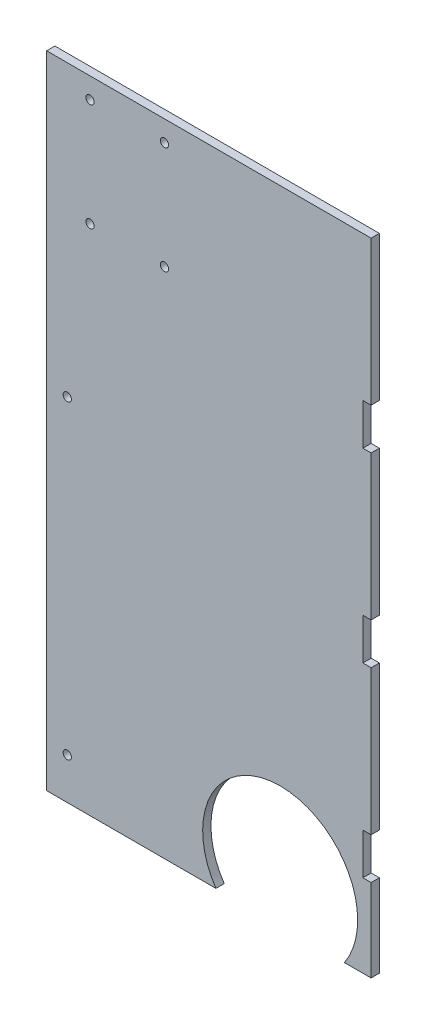
ISO-10303-21;
HEADER;
FILE_DESCRIPTION(('STEP AP214'),'2;1');
FILE_NAME('part.step','',(''),(''),'','','');
FILE_SCHEMA(('AUTOMOTIVE_DESIGN { 1 0 10303 214 1 1 1 1 }'));
ENDSEC;
DATA;
#1=APPLICATION_CONTEXT('core data for automotive mechanical design processes');
#2=APPLICATION_PROTOCOL_DEFINITION('international standard','automotive_design',2000,#1);
#3=PRODUCT_CONTEXT('',#1,'mechanical');
#4=PRODUCT('Part','Part','',(#3));
#5=PRODUCT_RELATED_PRODUCT_CATEGORY('part','',(#4));
#6=PRODUCT_DEFINITION_FORMATION('','',#4);
#7=PRODUCT_DEFINITION_CONTEXT('part definition',#1,'design');
#8=PRODUCT_DEFINITION('design','',#6,#7);
#9=PRODUCT_DEFINITION_SHAPE('','',#8);
#10=(LENGTH_UNIT() NAMED_UNIT(*) SI_UNIT(.MILLI.,.METRE.));
#11=(NAMED_UNIT(*) PLANE_ANGLE_UNIT() SI_UNIT($,.RADIAN.));
#12=(NAMED_UNIT(*) SI_UNIT($,.STERADIAN.) SOLID_ANGLE_UNIT());
#13=UNCERTAINTY_MEASURE_WITH_UNIT(LENGTH_MEASURE(1.E-05),#10,'distance_accuracy_value','');
#14=(GEOMETRIC_REPRESENTATION_CONTEXT(3) GLOBAL_UNCERTAINTY_ASSIGNED_CONTEXT((#13)) GLOBAL_UNIT_ASSIGNED_CONTEXT((#10,
#11,#12)) REPRESENTATION_CONTEXT('',''));
#15=CARTESIAN_POINT('',(0.,0.,0.));
#16=DIRECTION('',(0.,0.,1.));
#17=DIRECTION('',(1.,0.,0.));
#18=AXIS2_PLACEMENT_3D('',#15,#16,#17);
#19=CARTESIAN_POINT('',(82.0000000000016,149.999999999996,4.));
#20=DIRECTION('',(-1.,0.,0.));
#21=DIRECTION('',(0.,-1.,0.));
#22=AXIS2_PLACEMENT_3D('',#19,#20,#21);
#23=PLANE('',#22);
#24=DIRECTION('',(0.,1.,0.));
#25=VECTOR('',#24,1.);
#26=CARTESIAN_POINT('',(82.0000000000016,149.999999999996,0.));
#27=LINE('',#26,#25);
#28=CARTESIAN_POINT('',(82.0000000000016,-30.0000000000036,0.));
#29=VERTEX_POINT('',#28);
#30=CARTESIAN_POINT('',(82.0000000000015,39.9999999999964,0.));
#31=VERTEX_POINT('',#30);
#32=EDGE_CURVE('E415',#29,#31,#27,.T.);
#33=ORIENTED_EDGE('',*,*,#32,.T.);
#34=DIRECTION('',(0.,0.,-1.));
#35=VECTOR('',#34,1.);
#36=CARTESIAN_POINT('',(82.0000000000015,39.9999999999964,4.));
#37=LINE('',#36,#35);
#38=CARTESIAN_POINT('',(82.0000000000015,39.9999999999964,4.));
#39=VERTEX_POINT('',#38);
#40=EDGE_CURVE('E281',#39,#31,#37,.T.);
#41=ORIENTED_EDGE('',*,*,#40,.F.);
#42=DIRECTION('',(0.,1.,0.));
#43=VECTOR('',#42,1.);
#44=CARTESIAN_POINT('',(82.0000000000016,149.999999999996,4.));
#45=LINE('',#44,#43);
#46=CARTESIAN_POINT('',(82.0000000000016,-30.0000000000036,4.));
#47=VERTEX_POINT('',#46);
#48=EDGE_CURVE('E429',#47,#39,#45,.T.);
#49=ORIENTED_EDGE('',*,*,#48,.F.);
#50=DIRECTION('',(0.,0.,-1.));
#51=VECTOR('',#50,1.);
#52=CARTESIAN_POINT('',(82.0000000000016,-30.0000000000036,4.));
#53=LINE('',#52,#51);
#54=EDGE_CURVE('E252',#47,#29,#53,.T.);
#55=ORIENTED_EDGE('',*,*,#54,.T.);
#56=EDGE_LOOP('',(#33,#41,#49,#55));
#57=FACE_BOUND('',#56,.T.);
#58=ADVANCED_FACE('F33',(#57),#23,.F.);
#59=CARTESIAN_POINT('',(82.0000000000015,-120.000000000004,0.));
#60=VERTEX_POINT('',#59);
#61=CARTESIAN_POINT('',(82.0000000000016,-50.0000000000036,0.));
#62=VERTEX_POINT('',#61);
#63=EDGE_CURVE('E217',#60,#62,#27,.T.);
#64=ORIENTED_EDGE('',*,*,#63,.T.);
#65=DIRECTION('',(0.,0.,-1.));
#66=VECTOR('',#65,1.);
#67=CARTESIAN_POINT('',(82.0000000000016,-50.0000000000036,4.));
#68=LINE('',#67,#66);
#69=CARTESIAN_POINT('',(82.0000000000016,-50.0000000000036,4.));
#70=VERTEX_POINT('',#69);
#71=EDGE_CURVE('E256',#70,#62,#68,.T.);
#72=ORIENTED_EDGE('',*,*,#71,.F.);
#73=CARTESIAN_POINT('',(82.0000000000016,-120.000000000004,4.));
#74=VERTEX_POINT('',#73);
#75=EDGE_CURVE('E221',#74,#70,#45,.T.);
#76=ORIENTED_EDGE('',*,*,#75,.F.);
#77=DIRECTION('',(0.,0.,-1.));
#78=VECTOR('',#77,1.);
#79=CARTESIAN_POINT('',(82.0000000000016,-120.000000000004,4.));
#80=LINE('',#79,#78);
#81=EDGE_CURVE('E224',#74,#60,#80,.T.);
#82=ORIENTED_EDGE('',*,*,#81,.T.);
#83=EDGE_LOOP('',(#64,#72,#76,#82));
#84=FACE_BOUND('',#83,.T.);
#85=ADVANCED_FACE('F374',(#84),#23,.F.);
#86=CARTESIAN_POINT('',(82.0000000000008,-180.000000000003,0.));
#87=VERTEX_POINT('',#86);
#88=CARTESIAN_POINT('',(82.0000000000016,-140.000000000004,0.));
#89=VERTEX_POINT('',#88);
#90=EDGE_CURVE('E214',#87,#89,#27,.T.);
#91=ORIENTED_EDGE('',*,*,#90,.T.);
#92=DIRECTION('',(0.,0.,-1.));
#93=VECTOR('',#92,1.);
#94=CARTESIAN_POINT('',(82.0000000000016,-140.000000000004,4.));
#95=LINE('',#94,#93);
#96=CARTESIAN_POINT('',(82.0000000000016,-140.000000000004,4.));
#97=VERTEX_POINT('',#96);
#98=EDGE_CURVE('E228',#97,#89,#95,.T.);
#99=ORIENTED_EDGE('',*,*,#98,.F.);
#100=CARTESIAN_POINT('',(82.0000000000008,-180.000000000003,4.));
#101=VERTEX_POINT('',#100);
#102=EDGE_CURVE('E211',#101,#97,#45,.T.);
#103=ORIENTED_EDGE('',*,*,#102,.F.);
#104=DIRECTION('',(0.,0.,1.));
#105=VECTOR('',#104,1.);
#106=CARTESIAN_POINT('',(82.0000000000008,-180.000000000003,0.));
#107=LINE('',#106,#105);
#108=EDGE_CURVE('E242',#87,#101,#107,.T.);
#109=ORIENTED_EDGE('',*,*,#108,.F.);
#110=EDGE_LOOP('',(#91,#99,#103,#109));
#111=FACE_BOUND('',#110,.T.);
#112=ADVANCED_FACE('F380',(#111),#23,.F.);
#113=CARTESIAN_POINT('',(-74.9999999999984,-180.000000000003,4.));
#114=DIRECTION('',(0.,1.,0.));
#115=DIRECTION('',(0.,0.,1.));
#116=AXIS2_PLACEMENT_3D('',#113,#114,#115);
#117=PLANE('',#116);
#118=DIRECTION('',(1.,0.,0.));
#119=VECTOR('',#118,1.);
#120=CARTESIAN_POINT('',(-74.9999999999984,-180.000000000003,0.));
#121=LINE('',#120,#119);
#122=CARTESIAN_POINT('',(-74.9999999999984,-180.000000000003,0.));
#123=VERTEX_POINT('',#122);
#124=CARTESIAN_POINT('',(6.93152723420449,-180.000000000003,0.));
#125=VERTEX_POINT('',#124);
#126=EDGE_CURVE('E180',#123,#125,#121,.T.);
#127=ORIENTED_EDGE('',*,*,#126,.T.);
#128=DIRECTION('',(0.,0.,1.));
#129=VECTOR('',#128,1.);
#130=CARTESIAN_POINT('',(6.93152723420449,-180.000000000003,0.));
#131=LINE('',#130,#129);
#132=CARTESIAN_POINT('',(6.93152723420449,-180.000000000003,4.));
#133=VERTEX_POINT('',#132);
#134=EDGE_CURVE('E189',#125,#133,#131,.T.);
#135=ORIENTED_EDGE('',*,*,#134,.T.);
#136=DIRECTION('',(1.,0.,0.));
#137=VECTOR('',#136,1.);
#138=CARTESIAN_POINT('',(-74.9999999999984,-180.000000000003,4.));
#139=LINE('',#138,#137);
#140=CARTESIAN_POINT('',(-74.9999999999984,-180.000000000003,4.));
#141=VERTEX_POINT('',#140);
#142=EDGE_CURVE('E183',#141,#133,#139,.T.);
#143=ORIENTED_EDGE('',*,*,#142,.F.);
#144=DIRECTION('',(0.,0.,-1.));
#145=VECTOR('',#144,1.);
#146=CARTESIAN_POINT('',(-74.9999999999984,-180.000000000003,4.));
#147=LINE('',#146,#145);
#148=EDGE_CURVE('E41',#141,#123,#147,.T.);
#149=ORIENTED_EDGE('',*,*,#148,.T.);
#150=EDGE_LOOP('',(#127,#135,#143,#149));
#151=FACE_BOUND('',#150,.T.);
#152=ADVANCED_FACE('F195',(#151),#117,.F.);
#153=CARTESIAN_POINT('',(-74.9999999999984,149.999999999996,4.));
#154=DIRECTION('',(1.,0.,0.));
#155=DIRECTION('',(0.,1.,0.));
#156=AXIS2_PLACEMENT_3D('',#153,#154,#155);
#157=PLANE('',#156);
#158=DIRECTION('',(0.,-1.,0.));
#159=VECTOR('',#158,1.);
#160=CARTESIAN_POINT('',(-74.9999999999984,149.999999999996,4.));
#161=LINE('',#160,#159);
#162=CARTESIAN_POINT('',(-74.9999999999984,129.999999999996,4.));
#163=VERTEX_POINT('',#162);
#164=EDGE_CURVE('E161',#163,#141,#161,.T.);
#165=ORIENTED_EDGE('',*,*,#164,.F.);
#166=DIRECTION('',(0.,0.,-1.));
#167=VECTOR('',#166,1.);
#168=CARTESIAN_POINT('',(-74.9999999999984,129.999999999996,4.));
#169=LINE('',#168,#167);
#170=CARTESIAN_POINT('',(-74.9999999999984,129.999999999996,0.));
#171=VERTEX_POINT('',#170);
#172=EDGE_CURVE('E170',#163,#171,#169,.T.);
#173=ORIENTED_EDGE('',*,*,#172,.T.);
#174=DIRECTION('',(0.,-1.,0.));
#175=VECTOR('',#174,1.);
#176=CARTESIAN_POINT('',(-74.9999999999984,149.999999999996,0.));
#177=LINE('',#176,#175);
#178=EDGE_CURVE('E192',#171,#123,#177,.T.);
#179=ORIENTED_EDGE('',*,*,#178,.T.);
#180=ORIENTED_EDGE('',*,*,#148,.F.);
#181=EDGE_LOOP('',(#165,#173,#179,#180));
#182=FACE_BOUND('',#181,.T.);
#183=ADVANCED_FACE('F35',(#182),#157,.F.);
#184=CARTESIAN_POINT('',(69.0684727658297,-180.000000000003,0.));
#185=VERTEX_POINT('',#184);
#186=EDGE_CURVE('E186',#185,#87,#121,.T.);
#187=ORIENTED_EDGE('',*,*,#186,.T.);
#188=ORIENTED_EDGE('',*,*,#108,.T.);
#189=CARTESIAN_POINT('',(69.0684727658297,-180.000000000003,4.));
#190=VERTEX_POINT('',#189);
#191=EDGE_CURVE('E179',#190,#101,#139,.T.);
#192=ORIENTED_EDGE('',*,*,#191,.F.);
#193=DIRECTION('',(0.,0.,1.));
#194=VECTOR('',#193,1.);
#195=CARTESIAN_POINT('',(69.0684727658297,-180.000000000003,0.));
#196=LINE('',#195,#194);
#197=EDGE_CURVE('E204',#190,#185,#196,.F.);
#198=ORIENTED_EDGE('',*,*,#197,.T.);
#199=EDGE_LOOP('',(#187,#188,#192,#198));
#200=FACE_BOUND('',#199,.T.);
#201=ADVANCED_FACE('F208',(#200),#117,.F.);
#202=CARTESIAN_POINT('',(0.,0.,4.));
#203=DIRECTION('',(0.,0.,1.));
#204=DIRECTION('',(1.,0.,0.));
#205=AXIS2_PLACEMENT_3D('',#202,#203,#204);
#206=PLANE('',#205);
#207=DIRECTION('',(-1.,0.,0.));
#208=VECTOR('',#207,1.);
#209=CARTESIAN_POINT('',(78.0000000000015,129.999999999996,4.));
#210=LINE('',#209,#208);
#211=CARTESIAN_POINT('',(82.0000000000016,129.999999999996,4.));
#212=VERTEX_POINT('',#211);
#213=EDGE_CURVE('E48',#212,#163,#210,.T.);
#214=ORIENTED_EDGE('',*,*,#213,.T.);
#215=ORIENTED_EDGE('',*,*,#164,.T.);
#216=ORIENTED_EDGE('',*,*,#142,.T.);
#217=CARTESIAN_POINT('',(38.0000000000171,-159.000000000004,4.));
#218=DIRECTION('',(0.,0.,1.));
#219=DIRECTION('',(1.,0.,0.));
#220=AXIS2_PLACEMENT_3D('',#217,#218,#219);
#221=CIRCLE('',#220,37.5);
#222=EDGE_CURVE('E210',#190,#133,#221,.T.);
#223=ORIENTED_EDGE('',*,*,#222,.F.);
#224=ORIENTED_EDGE('',*,*,#191,.T.);
#225=ORIENTED_EDGE('',*,*,#102,.T.);
#226=DIRECTION('',(-1.,0.,0.));
#227=VECTOR('',#226,1.);
#228=CARTESIAN_POINT('',(78.0000000000015,-140.000000000004,4.));
#229=LINE('',#228,#227);
#230=CARTESIAN_POINT('',(78.0000000000015,-140.000000000004,4.));
#231=VERTEX_POINT('',#230);
#232=EDGE_CURVE('E225',#97,#231,#229,.T.);
#233=ORIENTED_EDGE('',*,*,#232,.T.);
#234=DIRECTION('',(0.,1.,0.));
#235=VECTOR('',#234,1.);
#236=CARTESIAN_POINT('',(78.0000000000015,-120.000000000004,4.));
#237=LINE('',#236,#235);
#238=CARTESIAN_POINT('',(78.0000000000015,-120.000000000004,4.));
#239=VERTEX_POINT('',#238);
#240=EDGE_CURVE('E236',#231,#239,#237,.T.);
#241=ORIENTED_EDGE('',*,*,#240,.T.);
#242=DIRECTION('',(1.,0.,0.));
#243=VECTOR('',#242,1.);
#244=CARTESIAN_POINT('',(78.0000000000015,-120.000000000004,4.));
#245=LINE('',#244,#243);
#246=EDGE_CURVE('E245',#239,#74,#245,.T.);
#247=ORIENTED_EDGE('',*,*,#246,.T.);
#248=ORIENTED_EDGE('',*,*,#75,.T.);
#249=DIRECTION('',(-1.,0.,0.));
#250=VECTOR('',#249,1.);
#251=CARTESIAN_POINT('',(78.0000000000015,-50.0000000000036,4.));
#252=LINE('',#251,#250);
#253=CARTESIAN_POINT('',(78.0000000000015,-50.0000000000036,4.));
#254=VERTEX_POINT('',#253);
#255=EDGE_CURVE('E253',#70,#254,#252,.T.);
#256=ORIENTED_EDGE('',*,*,#255,.T.);
#257=DIRECTION('',(0.,1.,0.));
#258=VECTOR('',#257,1.);
#259=CARTESIAN_POINT('',(78.0000000000015,-30.0000000000036,4.));
#260=LINE('',#259,#258);
#261=CARTESIAN_POINT('',(78.0000000000015,-30.0000000000036,4.));
#262=VERTEX_POINT('',#261);
#263=EDGE_CURVE('E264',#254,#262,#260,.T.);
#264=ORIENTED_EDGE('',*,*,#263,.T.);
#265=DIRECTION('',(1.,0.,0.));
#266=VECTOR('',#265,1.);
#267=CARTESIAN_POINT('',(78.0000000000015,-30.0000000000036,4.));
#268=LINE('',#267,#266);
#269=EDGE_CURVE('E271',#262,#47,#268,.T.);
#270=ORIENTED_EDGE('',*,*,#269,.T.);
#271=ORIENTED_EDGE('',*,*,#48,.T.);
#272=DIRECTION('',(-1.,0.,0.));
#273=VECTOR('',#272,1.);
#274=CARTESIAN_POINT('',(78.0000000000015,39.9999999999964,4.));
#275=LINE('',#274,#273);
#276=CARTESIAN_POINT('',(78.0000000000015,39.9999999999964,4.));
#277=VERTEX_POINT('',#276);
#278=EDGE_CURVE('E279',#39,#277,#275,.T.);
#279=ORIENTED_EDGE('',*,*,#278,.T.);
#280=DIRECTION('',(0.,1.,0.));
#281=VECTOR('',#280,1.);
#282=CARTESIAN_POINT('',(78.0000000000015,59.9999999999964,4.));
#283=LINE('',#282,#281);
#284=CARTESIAN_POINT('',(78.0000000000015,59.9999999999964,4.));
#285=VERTEX_POINT('',#284);
#286=EDGE_CURVE('E288',#277,#285,#283,.T.);
#287=ORIENTED_EDGE('',*,*,#286,.T.);
#288=DIRECTION('',(1.,0.,0.));
#289=VECTOR('',#288,1.);
#290=CARTESIAN_POINT('',(78.0000000000015,59.9999999999964,4.));
#291=LINE('',#290,#289);
#292=CARTESIAN_POINT('',(82.0000000000016,59.9999999999964,4.));
#293=VERTEX_POINT('',#292);
#294=EDGE_CURVE('E294',#285,#293,#291,.T.);
#295=ORIENTED_EDGE('',*,*,#294,.T.);
#296=EDGE_CURVE('E165',#293,#212,#45,.T.);
#297=ORIENTED_EDGE('',*,*,#296,.T.);
#298=EDGE_LOOP('',(#214,#215,#216,#223,#224,#225,#233,#241,#247,#248,#256,#264,#270,#271,#279,
#287,#295,#297));
#299=FACE_BOUND('',#298,.T.);
#300=CARTESIAN_POINT('',(-64.9999999999984,-10.0000000000036,4.));
#301=DIRECTION('',(0.,0.,1.));
#302=DIRECTION('',(1.,0.,0.));
#303=AXIS2_PLACEMENT_3D('',#300,#301,#302);
#304=CIRCLE('',#303,2.);
#305=CARTESIAN_POINT('',(-62.9999999999984,-10.0000000000036,4.));
#306=VERTEX_POINT('',#305);
#307=EDGE_CURVE('E331',#306,#306,#304,.T.);
#308=ORIENTED_EDGE('',*,*,#307,.F.);
#309=EDGE_LOOP('',(#308));
#310=FACE_BOUND('',#309,.T.);
#311=CARTESIAN_POINT('',(-64.9999999999984,-160.000000000004,4.));
#312=DIRECTION('',(0.,0.,1.));
#313=DIRECTION('',(1.,0.,0.));
#314=AXIS2_PLACEMENT_3D('',#311,#312,#313);
#315=CIRCLE('',#314,2.);
#316=CARTESIAN_POINT('',(-62.9999999999984,-160.000000000004,4.));
#317=VERTEX_POINT('',#316);
#318=EDGE_CURVE('E175',#317,#317,#315,.T.);
#319=ORIENTED_EDGE('',*,*,#318,.F.);
#320=EDGE_LOOP('',(#319));
#321=FACE_BOUND('',#320,.T.);
#322=CARTESIAN_POINT('',(-53.9999999999984,119.999999999996,4.));
#323=DIRECTION('',(0.,0.,-1.));
#324=DIRECTION('',(-1.,0.,0.));
#325=AXIS2_PLACEMENT_3D('',#322,#323,#324);
#326=CIRCLE('',#325,2.);
#327=CARTESIAN_POINT('',(-55.9999999999984,119.999999999996,4.));
#328=VERTEX_POINT('',#327);
#329=EDGE_CURVE('E305',#328,#328,#326,.T.);
#330=ORIENTED_EDGE('',*,*,#329,.T.);
#331=EDGE_LOOP('',(#330));
#332=FACE_BOUND('',#331,.T.);
#333=CARTESIAN_POINT('',(-17.9999999999984,67.9999999999964,4.));
#334=DIRECTION('',(0.,0.,-1.));
#335=DIRECTION('',(-1.,0.,0.));
#336=AXIS2_PLACEMENT_3D('',#333,#334,#335);
#337=CIRCLE('',#336,2.);
#338=CARTESIAN_POINT('',(-19.9999999999984,67.9999999999964,4.));
#339=VERTEX_POINT('',#338);
#340=EDGE_CURVE('E311',#339,#339,#337,.T.);
#341=ORIENTED_EDGE('',*,*,#340,.T.);
#342=EDGE_LOOP('',(#341));
#343=FACE_BOUND('',#342,.T.);
#344=CARTESIAN_POINT('',(-53.9999999999984,67.9999999999964,4.));
#345=DIRECTION('',(0.,0.,-1.));
#346=DIRECTION('',(-1.,0.,0.));
#347=AXIS2_PLACEMENT_3D('',#344,#345,#346);
#348=CIRCLE('',#347,2.);
#349=CARTESIAN_POINT('',(-55.9999999999984,67.9999999999964,4.));
#350=VERTEX_POINT('',#349);
#351=EDGE_CURVE('E312',#350,#350,#348,.T.);
#352=ORIENTED_EDGE('',*,*,#351,.T.);
#353=EDGE_LOOP('',(#352));
#354=FACE_BOUND('',#353,.T.);
#355=CARTESIAN_POINT('',(-17.9999999999984,119.999999999996,4.));
#356=DIRECTION('',(0.,0.,-1.));
#357=DIRECTION('',(-1.,0.,0.));
#358=AXIS2_PLACEMENT_3D('',#355,#356,#357);
#359=CIRCLE('',#358,2.);
#360=CARTESIAN_POINT('',(-19.9999999999984,119.999999999996,4.));
#361=VERTEX_POINT('',#360);
#362=EDGE_CURVE('E301',#361,#361,#359,.T.);
#363=ORIENTED_EDGE('',*,*,#362,.T.);
#364=EDGE_LOOP('',(#363));
#365=FACE_BOUND('',#364,.T.);
#366=ADVANCED_FACE('F157',(#299,#310,#321,#332,#343,#354,#365),#206,.T.);
#367=CARTESIAN_POINT('',(0.,0.,0.));
#368=DIRECTION('',(0.,0.,1.));
#369=DIRECTION('',(1.,0.,0.));
#370=AXIS2_PLACEMENT_3D('',#367,#368,#369);
#371=PLANE('',#370);
#372=CARTESIAN_POINT('',(-64.9999999999984,-10.0000000000036,0.));
#373=DIRECTION('',(0.,0.,1.));
#374=DIRECTION('',(1.,0.,0.));
#375=AXIS2_PLACEMENT_3D('',#372,#373,#374);
#376=CIRCLE('',#375,2.);
#377=CARTESIAN_POINT('',(-62.9999999999984,-10.0000000000036,0.));
#378=VERTEX_POINT('',#377);
#379=EDGE_CURVE('E323',#378,#378,#376,.T.);
#380=ORIENTED_EDGE('',*,*,#379,.T.);
#381=EDGE_LOOP('',(#380));
#382=FACE_BOUND('',#381,.T.);
#383=CARTESIAN_POINT('',(-64.9999999999984,-160.000000000004,0.));
#384=DIRECTION('',(0.,0.,1.));
#385=DIRECTION('',(1.,0.,0.));
#386=AXIS2_PLACEMENT_3D('',#383,#384,#385);
#387=CIRCLE('',#386,2.);
#388=CARTESIAN_POINT('',(-62.9999999999984,-160.000000000004,0.));
#389=VERTEX_POINT('',#388);
#390=EDGE_CURVE('E328',#389,#389,#387,.T.);
#391=ORIENTED_EDGE('',*,*,#390,.T.);
#392=EDGE_LOOP('',(#391));
#393=FACE_BOUND('',#392,.T.);
#394=CARTESIAN_POINT('',(-53.9999999999984,119.999999999996,0.));
#395=DIRECTION('',(0.,0.,-1.));
#396=DIRECTION('',(-1.,0.,0.));
#397=AXIS2_PLACEMENT_3D('',#394,#395,#396);
#398=CIRCLE('',#397,2.);
#399=CARTESIAN_POINT('',(-55.9999999999984,119.999999999996,0.));
#400=VERTEX_POINT('',#399);
#401=EDGE_CURVE('E315',#400,#400,#398,.T.);
#402=ORIENTED_EDGE('',*,*,#401,.F.);
#403=EDGE_LOOP('',(#402));
#404=FACE_BOUND('',#403,.T.);
#405=CARTESIAN_POINT('',(-17.9999999999984,67.9999999999964,0.));
#406=DIRECTION('',(0.,0.,-1.));
#407=DIRECTION('',(-1.,0.,0.));
#408=AXIS2_PLACEMENT_3D('',#405,#406,#407);
#409=CIRCLE('',#408,2.);
#410=CARTESIAN_POINT('',(-19.9999999999984,67.9999999999964,0.));
#411=VERTEX_POINT('',#410);
#412=EDGE_CURVE('E308',#411,#411,#409,.T.);
#413=ORIENTED_EDGE('',*,*,#412,.F.);
#414=EDGE_LOOP('',(#413));
#415=FACE_BOUND('',#414,.T.);
#416=CARTESIAN_POINT('',(-53.9999999999984,67.9999999999964,0.));
#417=DIRECTION('',(0.,0.,-1.));
#418=DIRECTION('',(-1.,0.,0.));
#419=AXIS2_PLACEMENT_3D('',#416,#417,#418);
#420=CIRCLE('',#419,2.);
#421=CARTESIAN_POINT('',(-55.9999999999984,67.9999999999964,0.));
#422=VERTEX_POINT('',#421);
#423=EDGE_CURVE('E320',#422,#422,#420,.T.);
#424=ORIENTED_EDGE('',*,*,#423,.F.);
#425=EDGE_LOOP('',(#424));
#426=FACE_BOUND('',#425,.T.);
#427=CARTESIAN_POINT('',(-17.9999999999984,119.999999999996,0.));
#428=DIRECTION('',(0.,0.,-1.));
#429=DIRECTION('',(-1.,0.,0.));
#430=AXIS2_PLACEMENT_3D('',#427,#428,#429);
#431=CIRCLE('',#430,2.);
#432=CARTESIAN_POINT('',(-19.9999999999984,119.999999999996,0.));
#433=VERTEX_POINT('',#432);
#434=EDGE_CURVE('E302',#433,#433,#431,.T.);
#435=ORIENTED_EDGE('',*,*,#434,.F.);
#436=EDGE_LOOP('',(#435));
#437=FACE_BOUND('',#436,.T.);
#438=ORIENTED_EDGE('',*,*,#178,.F.);
#439=DIRECTION('',(-1.,0.,0.));
#440=VECTOR('',#439,1.);
#441=CARTESIAN_POINT('',(78.0000000000015,129.999999999996,0.));
#442=LINE('',#441,#440);
#443=CARTESIAN_POINT('',(82.0000000000015,129.999999999996,0.));
#444=VERTEX_POINT('',#443);
#445=EDGE_CURVE('E167',#444,#171,#442,.T.);
#446=ORIENTED_EDGE('',*,*,#445,.F.);
#447=CARTESIAN_POINT('',(82.0000000000016,59.9999999999964,0.));
#448=VERTEX_POINT('',#447);
#449=EDGE_CURVE('E218',#448,#444,#27,.T.);
#450=ORIENTED_EDGE('',*,*,#449,.F.);
#451=DIRECTION('',(1.,0.,0.));
#452=VECTOR('',#451,1.);
#453=CARTESIAN_POINT('',(78.0000000000015,59.9999999999964,0.));
#454=LINE('',#453,#452);
#455=CARTESIAN_POINT('',(78.0000000000015,59.9999999999964,0.));
#456=VERTEX_POINT('',#455);
#457=EDGE_CURVE('E56',#456,#448,#454,.T.);
#458=ORIENTED_EDGE('',*,*,#457,.F.);
#459=DIRECTION('',(0.,1.,0.));
#460=VECTOR('',#459,1.);
#461=CARTESIAN_POINT('',(78.0000000000015,59.9999999999964,0.));
#462=LINE('',#461,#460);
#463=CARTESIAN_POINT('',(78.0000000000015,39.9999999999964,0.));
#464=VERTEX_POINT('',#463);
#465=EDGE_CURVE('E260',#464,#456,#462,.T.);
#466=ORIENTED_EDGE('',*,*,#465,.F.);
#467=DIRECTION('',(-1.,0.,0.));
#468=VECTOR('',#467,1.);
#469=CARTESIAN_POINT('',(78.0000000000015,39.9999999999964,0.));
#470=LINE('',#469,#468);
#471=EDGE_CURVE('E285',#31,#464,#470,.T.);
#472=ORIENTED_EDGE('',*,*,#471,.F.);
#473=ORIENTED_EDGE('',*,*,#32,.F.);
#474=DIRECTION('',(1.,0.,0.));
#475=VECTOR('',#474,1.);
#476=CARTESIAN_POINT('',(78.0000000000015,-30.0000000000036,0.));
#477=LINE('',#476,#475);
#478=CARTESIAN_POINT('',(78.0000000000015,-30.0000000000036,0.));
#479=VERTEX_POINT('',#478);
#480=EDGE_CURVE('E265',#479,#29,#477,.T.);
#481=ORIENTED_EDGE('',*,*,#480,.F.);
#482=DIRECTION('',(0.,1.,0.));
#483=VECTOR('',#482,1.);
#484=CARTESIAN_POINT('',(78.0000000000015,-30.0000000000036,0.));
#485=LINE('',#484,#483);
#486=CARTESIAN_POINT('',(78.0000000000015,-50.0000000000036,0.));
#487=VERTEX_POINT('',#486);
#488=EDGE_CURVE('E232',#487,#479,#485,.T.);
#489=ORIENTED_EDGE('',*,*,#488,.F.);
#490=DIRECTION('',(-1.,0.,0.));
#491=VECTOR('',#490,1.);
#492=CARTESIAN_POINT('',(78.0000000000015,-50.0000000000036,0.));
#493=LINE('',#492,#491);
#494=EDGE_CURVE('E261',#62,#487,#493,.T.);
#495=ORIENTED_EDGE('',*,*,#494,.F.);
#496=ORIENTED_EDGE('',*,*,#63,.F.);
#497=DIRECTION('',(1.,0.,0.));
#498=VECTOR('',#497,1.);
#499=CARTESIAN_POINT('',(78.0000000000015,-120.000000000004,0.));
#500=LINE('',#499,#498);
#501=CARTESIAN_POINT('',(78.0000000000015,-120.000000000004,0.));
#502=VERTEX_POINT('',#501);
#503=EDGE_CURVE('E237',#502,#60,#500,.T.);
#504=ORIENTED_EDGE('',*,*,#503,.F.);
#505=DIRECTION('',(0.,1.,0.));
#506=VECTOR('',#505,1.);
#507=CARTESIAN_POINT('',(78.0000000000015,-120.000000000004,0.));
#508=LINE('',#507,#506);
#509=CARTESIAN_POINT('',(78.0000000000015,-140.000000000004,0.));
#510=VERTEX_POINT('',#509);
#511=EDGE_CURVE('E239',#510,#502,#508,.T.);
#512=ORIENTED_EDGE('',*,*,#511,.F.);
#513=DIRECTION('',(-1.,0.,0.));
#514=VECTOR('',#513,1.);
#515=CARTESIAN_POINT('',(78.0000000000015,-140.000000000004,0.));
#516=LINE('',#515,#514);
#517=EDGE_CURVE('E233',#89,#510,#516,.T.);
#518=ORIENTED_EDGE('',*,*,#517,.F.);
#519=ORIENTED_EDGE('',*,*,#90,.F.);
#520=ORIENTED_EDGE('',*,*,#186,.F.);
#521=CARTESIAN_POINT('',(38.0000000000171,-159.000000000004,0.));
#522=DIRECTION('',(0.,0.,1.));
#523=DIRECTION('',(1.,0.,0.));
#524=AXIS2_PLACEMENT_3D('',#521,#522,#523);
#525=CIRCLE('',#524,37.5);
#526=EDGE_CURVE('E11',#185,#125,#525,.T.);
#527=ORIENTED_EDGE('',*,*,#526,.T.);
#528=ORIENTED_EDGE('',*,*,#126,.F.);
#529=EDGE_LOOP('',(#438,#446,#450,#458,#466,#472,#473,#481,#489,#495,#496,#504,#512,#518,#519,
#520,#527,#528));
#530=FACE_BOUND('',#529,.T.);
#531=ADVANCED_FACE('F198',(#382,#393,#404,#415,#426,#437,#530),#371,.F.);
#532=CARTESIAN_POINT('',(38.0000000000171,-159.000000000004,0.));
#533=DIRECTION('',(0.,0.,1.));
#534=DIRECTION('',(1.,0.,0.));
#535=AXIS2_PLACEMENT_3D('',#532,#533,#534);
#536=CYLINDRICAL_SURFACE('',#535,37.5);
#537=ORIENTED_EDGE('',*,*,#526,.F.);
#538=ORIENTED_EDGE('',*,*,#197,.F.);
#539=ORIENTED_EDGE('',*,*,#222,.T.);
#540=ORIENTED_EDGE('',*,*,#134,.F.);
#541=EDGE_LOOP('',(#537,#538,#539,#540));
#542=FACE_BOUND('',#541,.T.);
#543=ADVANCED_FACE('F203',(#542),#536,.F.);
#544=ORIENTED_EDGE('',*,*,#449,.T.);
#545=DIRECTION('',(0.,0.,-1.));
#546=VECTOR('',#545,1.);
#547=CARTESIAN_POINT('',(82.0000000000015,129.999999999996,4.));
#548=LINE('',#547,#546);
#549=EDGE_CURVE('E166',#212,#444,#548,.T.);
#550=ORIENTED_EDGE('',*,*,#549,.F.);
#551=ORIENTED_EDGE('',*,*,#296,.F.);
#552=DIRECTION('',(0.,0.,-1.));
#553=VECTOR('',#552,1.);
#554=CARTESIAN_POINT('',(82.0000000000016,59.9999999999964,4.));
#555=LINE('',#554,#553);
#556=EDGE_CURVE('E278',#293,#448,#555,.T.);
#557=ORIENTED_EDGE('',*,*,#556,.T.);
#558=EDGE_LOOP('',(#544,#550,#551,#557));
#559=FACE_BOUND('',#558,.T.);
#560=ADVANCED_FACE('F371',(#559),#23,.F.);
#561=CARTESIAN_POINT('',(78.0000000000015,-120.000000000004,4.));
#562=DIRECTION('',(-1.,0.,0.));
#563=DIRECTION('',(0.,0.,1.));
#564=AXIS2_PLACEMENT_3D('',#561,#562,#563);
#565=PLANE('',#564);
#566=ORIENTED_EDGE('',*,*,#511,.T.);
#567=DIRECTION('',(0.,0.,-1.));
#568=VECTOR('',#567,1.);
#569=CARTESIAN_POINT('',(78.0000000000015,-120.000000000004,4.));
#570=LINE('',#569,#568);
#571=EDGE_CURVE('E222',#239,#502,#570,.T.);
#572=ORIENTED_EDGE('',*,*,#571,.F.);
#573=ORIENTED_EDGE('',*,*,#240,.F.);
#574=DIRECTION('',(0.,0.,-1.));
#575=VECTOR('',#574,1.);
#576=CARTESIAN_POINT('',(78.0000000000015,-140.000000000004,4.));
#577=LINE('',#576,#575);
#578=EDGE_CURVE('E230',#231,#510,#577,.T.);
#579=ORIENTED_EDGE('',*,*,#578,.T.);
#580=EDGE_LOOP('',(#566,#572,#573,#579));
#581=FACE_BOUND('',#580,.T.);
#582=ADVANCED_FACE('F385',(#581),#565,.F.);
#583=CARTESIAN_POINT('',(78.0000000000015,-140.000000000004,4.));
#584=DIRECTION('',(0.,-1.,0.));
#585=DIRECTION('',(0.,0.,-1.));
#586=AXIS2_PLACEMENT_3D('',#583,#584,#585);
#587=PLANE('',#586);
#588=ORIENTED_EDGE('',*,*,#517,.T.);
#589=ORIENTED_EDGE('',*,*,#578,.F.);
#590=ORIENTED_EDGE('',*,*,#232,.F.);
#591=ORIENTED_EDGE('',*,*,#98,.T.);
#592=EDGE_LOOP('',(#588,#589,#590,#591));
#593=FACE_BOUND('',#592,.T.);
#594=ADVANCED_FACE('F390',(#593),#587,.F.);
#595=CARTESIAN_POINT('',(78.0000000000015,-120.000000000004,4.));
#596=DIRECTION('',(0.,1.,0.));
#597=DIRECTION('',(0.,0.,1.));
#598=AXIS2_PLACEMENT_3D('',#595,#596,#597);
#599=PLANE('',#598);
#600=ORIENTED_EDGE('',*,*,#503,.T.);
#601=ORIENTED_EDGE('',*,*,#81,.F.);
#602=ORIENTED_EDGE('',*,*,#246,.F.);
#603=ORIENTED_EDGE('',*,*,#571,.T.);
#604=EDGE_LOOP('',(#600,#601,#602,#603));
#605=FACE_BOUND('',#604,.T.);
#606=ADVANCED_FACE('F409',(#605),#599,.F.);
#607=CARTESIAN_POINT('',(78.0000000000015,-30.0000000000036,4.));
#608=DIRECTION('',(-1.,0.,0.));
#609=DIRECTION('',(0.,0.,1.));
#610=AXIS2_PLACEMENT_3D('',#607,#608,#609);
#611=PLANE('',#610);
#612=ORIENTED_EDGE('',*,*,#488,.T.);
#613=DIRECTION('',(0.,0.,-1.));
#614=VECTOR('',#613,1.);
#615=CARTESIAN_POINT('',(78.0000000000015,-30.0000000000036,4.));
#616=LINE('',#615,#614);
#617=EDGE_CURVE('E250',#262,#479,#616,.T.);
#618=ORIENTED_EDGE('',*,*,#617,.F.);
#619=ORIENTED_EDGE('',*,*,#263,.F.);
#620=DIRECTION('',(0.,0.,-1.));
#621=VECTOR('',#620,1.);
#622=CARTESIAN_POINT('',(78.0000000000015,-50.0000000000036,4.));
#623=LINE('',#622,#621);
#624=EDGE_CURVE('E258',#254,#487,#623,.T.);
#625=ORIENTED_EDGE('',*,*,#624,.T.);
#626=EDGE_LOOP('',(#612,#618,#619,#625));
#627=FACE_BOUND('',#626,.T.);
#628=ADVANCED_FACE('F435',(#627),#611,.F.);
#629=CARTESIAN_POINT('',(78.0000000000015,-50.0000000000036,4.));
#630=DIRECTION('',(0.,-1.,0.));
#631=DIRECTION('',(0.,0.,-1.));
#632=AXIS2_PLACEMENT_3D('',#629,#630,#631);
#633=PLANE('',#632);
#634=ORIENTED_EDGE('',*,*,#494,.T.);
#635=ORIENTED_EDGE('',*,*,#624,.F.);
#636=ORIENTED_EDGE('',*,*,#255,.F.);
#637=ORIENTED_EDGE('',*,*,#71,.T.);
#638=EDGE_LOOP('',(#634,#635,#636,#637));
#639=FACE_BOUND('',#638,.T.);
#640=ADVANCED_FACE('F433',(#639),#633,.F.);
#641=CARTESIAN_POINT('',(78.0000000000015,-30.0000000000036,4.));
#642=DIRECTION('',(0.,1.,0.));
#643=DIRECTION('',(0.,0.,1.));
#644=AXIS2_PLACEMENT_3D('',#641,#642,#643);
#645=PLANE('',#644);
#646=ORIENTED_EDGE('',*,*,#480,.T.);
#647=ORIENTED_EDGE('',*,*,#54,.F.);
#648=ORIENTED_EDGE('',*,*,#269,.F.);
#649=ORIENTED_EDGE('',*,*,#617,.T.);
#650=EDGE_LOOP('',(#646,#647,#648,#649));
#651=FACE_BOUND('',#650,.T.);
#652=ADVANCED_FACE('F438',(#651),#645,.F.);
#653=CARTESIAN_POINT('',(78.0000000000015,59.9999999999964,4.));
#654=DIRECTION('',(-1.,0.,0.));
#655=DIRECTION('',(0.,0.,1.));
#656=AXIS2_PLACEMENT_3D('',#653,#654,#655);
#657=PLANE('',#656);
#658=ORIENTED_EDGE('',*,*,#465,.T.);
#659=DIRECTION('',(0.,0.,-1.));
#660=VECTOR('',#659,1.);
#661=CARTESIAN_POINT('',(78.0000000000015,59.9999999999964,4.));
#662=LINE('',#661,#660);
#663=EDGE_CURVE('E276',#285,#456,#662,.T.);
#664=ORIENTED_EDGE('',*,*,#663,.F.);
#665=ORIENTED_EDGE('',*,*,#286,.F.);
#666=DIRECTION('',(0.,0.,-1.));
#667=VECTOR('',#666,1.);
#668=CARTESIAN_POINT('',(78.0000000000015,39.9999999999964,4.));
#669=LINE('',#668,#667);
#670=EDGE_CURVE('E283',#277,#464,#669,.T.);
#671=ORIENTED_EDGE('',*,*,#670,.T.);
#672=EDGE_LOOP('',(#658,#664,#665,#671));
#673=FACE_BOUND('',#672,.T.);
#674=ADVANCED_FACE('F422',(#673),#657,.F.);
#675=CARTESIAN_POINT('',(78.0000000000015,39.9999999999964,4.));
#676=DIRECTION('',(0.,-1.,0.));
#677=DIRECTION('',(0.,0.,-1.));
#678=AXIS2_PLACEMENT_3D('',#675,#676,#677);
#679=PLANE('',#678);
#680=ORIENTED_EDGE('',*,*,#471,.T.);
#681=ORIENTED_EDGE('',*,*,#670,.F.);
#682=ORIENTED_EDGE('',*,*,#278,.F.);
#683=ORIENTED_EDGE('',*,*,#40,.T.);
#684=EDGE_LOOP('',(#680,#681,#682,#683));
#685=FACE_BOUND('',#684,.T.);
#686=ADVANCED_FACE('F426',(#685),#679,.F.);
#687=CARTESIAN_POINT('',(78.0000000000015,59.9999999999964,4.));
#688=DIRECTION('',(0.,1.,0.));
#689=DIRECTION('',(0.,0.,1.));
#690=AXIS2_PLACEMENT_3D('',#687,#688,#689);
#691=PLANE('',#690);
#692=ORIENTED_EDGE('',*,*,#457,.T.);
#693=ORIENTED_EDGE('',*,*,#556,.F.);
#694=ORIENTED_EDGE('',*,*,#294,.F.);
#695=ORIENTED_EDGE('',*,*,#663,.T.);
#696=EDGE_LOOP('',(#692,#693,#694,#695));
#697=FACE_BOUND('',#696,.T.);
#698=ADVANCED_FACE('F484',(#697),#691,.F.);
#699=CARTESIAN_POINT('',(78.0000000000015,129.999999999996,4.));
#700=DIRECTION('',(0.,-1.,0.));
#701=DIRECTION('',(0.,0.,-1.));
#702=AXIS2_PLACEMENT_3D('',#699,#700,#701);
#703=PLANE('',#702);
#704=ORIENTED_EDGE('',*,*,#445,.T.);
#705=ORIENTED_EDGE('',*,*,#172,.F.);
#706=ORIENTED_EDGE('',*,*,#213,.F.);
#707=ORIENTED_EDGE('',*,*,#549,.T.);
#708=EDGE_LOOP('',(#704,#705,#706,#707));
#709=FACE_BOUND('',#708,.T.);
#710=ADVANCED_FACE('F171',(#709),#703,.F.);
#711=CARTESIAN_POINT('',(-17.9999999999984,119.999999999996,4.));
#712=DIRECTION('',(0.,0.,-1.));
#713=DIRECTION('',(-1.,0.,0.));
#714=AXIS2_PLACEMENT_3D('',#711,#712,#713);
#715=CYLINDRICAL_SURFACE('',#714,2.);
#716=ORIENTED_EDGE('',*,*,#362,.F.);
#717=EDGE_LOOP('',(#716));
#718=FACE_BOUND('',#717,.T.);
#719=ORIENTED_EDGE('',*,*,#434,.T.);
#720=EDGE_LOOP('',(#719));
#721=FACE_BOUND('',#720,.T.);
#722=ADVANCED_FACE('F358',(#718,#721),#715,.F.);
#723=CARTESIAN_POINT('',(-53.9999999999984,67.9999999999964,4.));
#724=DIRECTION('',(0.,0.,-1.));
#725=DIRECTION('',(-1.,0.,0.));
#726=AXIS2_PLACEMENT_3D('',#723,#724,#725);
#727=CYLINDRICAL_SURFACE('',#726,2.);
#728=ORIENTED_EDGE('',*,*,#351,.F.);
#729=EDGE_LOOP('',(#728));
#730=FACE_BOUND('',#729,.T.);
#731=ORIENTED_EDGE('',*,*,#423,.T.);
#732=EDGE_LOOP('',(#731));
#733=FACE_BOUND('',#732,.T.);
#734=ADVANCED_FACE('F361',(#730,#733),#727,.F.);
#735=CARTESIAN_POINT('',(-17.9999999999984,67.9999999999964,4.));
#736=DIRECTION('',(0.,0.,-1.));
#737=DIRECTION('',(-1.,0.,0.));
#738=AXIS2_PLACEMENT_3D('',#735,#736,#737);
#739=CYLINDRICAL_SURFACE('',#738,2.);
#740=ORIENTED_EDGE('',*,*,#340,.F.);
#741=EDGE_LOOP('',(#740));
#742=FACE_BOUND('',#741,.T.);
#743=ORIENTED_EDGE('',*,*,#412,.T.);
#744=EDGE_LOOP('',(#743));
#745=FACE_BOUND('',#744,.T.);
#746=ADVANCED_FACE('F524',(#742,#745),#739,.F.);
#747=CARTESIAN_POINT('',(-53.9999999999984,119.999999999996,4.));
#748=DIRECTION('',(0.,0.,-1.));
#749=DIRECTION('',(-1.,0.,0.));
#750=AXIS2_PLACEMENT_3D('',#747,#748,#749);
#751=CYLINDRICAL_SURFACE('',#750,2.);
#752=ORIENTED_EDGE('',*,*,#329,.F.);
#753=EDGE_LOOP('',(#752));
#754=FACE_BOUND('',#753,.T.);
#755=ORIENTED_EDGE('',*,*,#401,.T.);
#756=EDGE_LOOP('',(#755));
#757=FACE_BOUND('',#756,.T.);
#758=ADVANCED_FACE('F534',(#754,#757),#751,.F.);
#759=CARTESIAN_POINT('',(-64.9999999999984,-160.000000000004,0.));
#760=DIRECTION('',(0.,0.,1.));
#761=DIRECTION('',(1.,0.,0.));
#762=AXIS2_PLACEMENT_3D('',#759,#760,#761);
#763=CYLINDRICAL_SURFACE('',#762,2.);
#764=ORIENTED_EDGE('',*,*,#390,.F.);
#765=EDGE_LOOP('',(#764));
#766=FACE_BOUND('',#765,.T.);
#767=ORIENTED_EDGE('',*,*,#318,.T.);
#768=EDGE_LOOP('',(#767));
#769=FACE_BOUND('',#768,.T.);
#770=ADVANCED_FACE('F342',(#766,#769),#763,.F.);
#771=CARTESIAN_POINT('',(-64.9999999999984,-10.0000000000036,0.));
#772=DIRECTION('',(0.,0.,1.));
#773=DIRECTION('',(1.,0.,0.));
#774=AXIS2_PLACEMENT_3D('',#771,#772,#773);
#775=CYLINDRICAL_SURFACE('',#774,2.);
#776=ORIENTED_EDGE('',*,*,#379,.F.);
#777=EDGE_LOOP('',(#776));
#778=FACE_BOUND('',#777,.T.);
#779=ORIENTED_EDGE('',*,*,#307,.T.);
#780=EDGE_LOOP('',(#779));
#781=FACE_BOUND('',#780,.T.);
#782=ADVANCED_FACE('F339',(#778,#781),#775,.F.);
#783=CLOSED_SHELL('',(#58,#85,#112,#152,#183,#201,#366,#531,#543,#560,#582,#594,#606,#628,#640,
#652,#674,#686,#698,#710,#722,#734,#746,#758,#770,#782));
#784=MANIFOLD_SOLID_BREP('B2',#783);
#785=ADVANCED_BREP_SHAPE_REPRESENTATION('',(#18,#784),#14);
#786=SHAPE_DEFINITION_REPRESENTATION(#9,#785);
ENDSEC;
END-ISO-10303-21;
